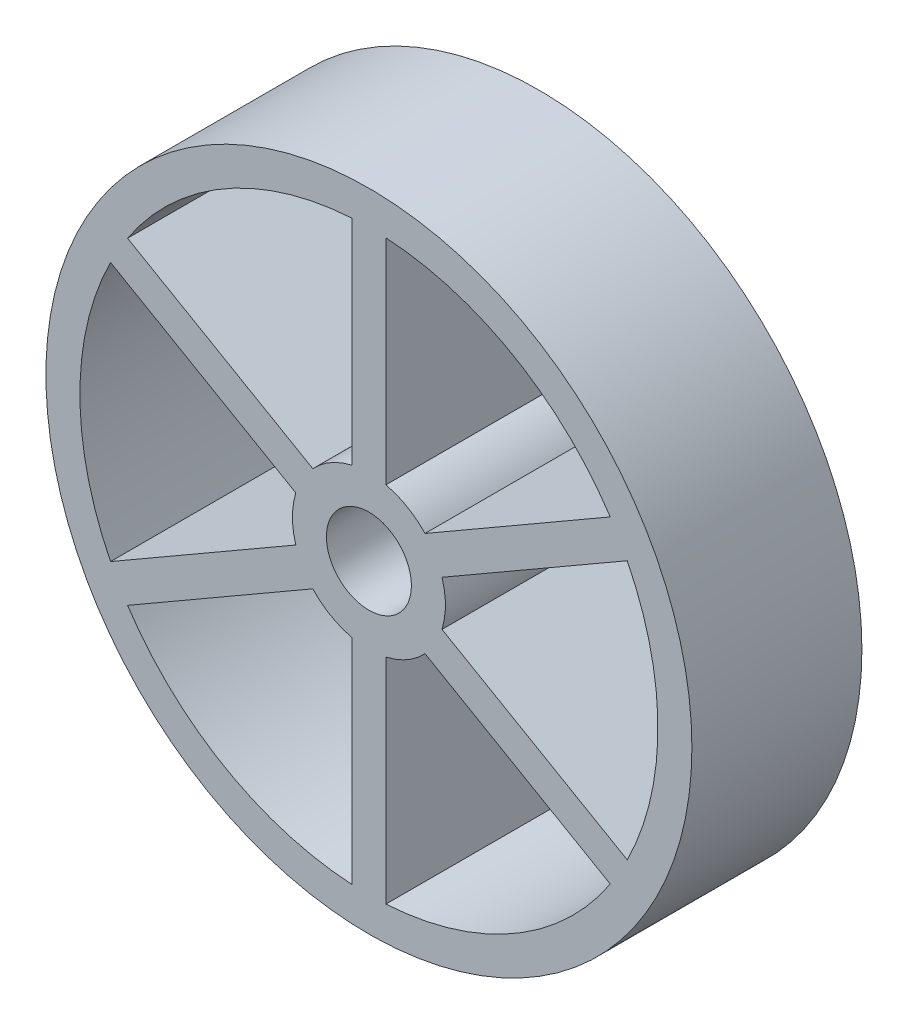
ISO-10303-21;
HEADER;
FILE_DESCRIPTION(('STEP AP214'),'2;1');
FILE_NAME('part.step','',(''),(''),'','','');
FILE_SCHEMA(('AUTOMOTIVE_DESIGN { 1 0 10303 214 1 1 1 1 }'));
ENDSEC;
DATA;
#1=APPLICATION_CONTEXT('core data for automotive mechanical design processes');
#2=APPLICATION_PROTOCOL_DEFINITION('international standard','automotive_design',2000,#1);
#3=PRODUCT_CONTEXT('',#1,'mechanical');
#4=PRODUCT('Part','Part','',(#3));
#5=PRODUCT_RELATED_PRODUCT_CATEGORY('part','',(#4));
#6=PRODUCT_DEFINITION_FORMATION('','',#4);
#7=PRODUCT_DEFINITION_CONTEXT('part definition',#1,'design');
#8=PRODUCT_DEFINITION('design','',#6,#7);
#9=PRODUCT_DEFINITION_SHAPE('','',#8);
#10=(LENGTH_UNIT() NAMED_UNIT(*) SI_UNIT(.MILLI.,.METRE.));
#11=(NAMED_UNIT(*) PLANE_ANGLE_UNIT() SI_UNIT($,.RADIAN.));
#12=(NAMED_UNIT(*) SI_UNIT($,.STERADIAN.) SOLID_ANGLE_UNIT());
#13=UNCERTAINTY_MEASURE_WITH_UNIT(LENGTH_MEASURE(1.E-05),#10,'distance_accuracy_value','');
#14=(GEOMETRIC_REPRESENTATION_CONTEXT(3) GLOBAL_UNCERTAINTY_ASSIGNED_CONTEXT((#13)) GLOBAL_UNIT_ASSIGNED_CONTEXT((#10,
#11,#12)) REPRESENTATION_CONTEXT('',''));
#15=CARTESIAN_POINT('',(0.,0.,0.));
#16=DIRECTION('',(0.,0.,1.));
#17=DIRECTION('',(1.,0.,0.));
#18=AXIS2_PLACEMENT_3D('',#15,#16,#17);
#19=CARTESIAN_POINT('',(0.,0.,10.));
#20=DIRECTION('',(0.,0.,-1.));
#21=DIRECTION('',(-1.,0.,0.));
#22=AXIS2_PLACEMENT_3D('',#19,#20,#21);
#23=CYLINDRICAL_SURFACE('',#22,19.);
#24=CARTESIAN_POINT('',(0.,0.,10.));
#25=DIRECTION('',(0.,0.,1.));
#26=DIRECTION('',(1.,0.,0.));
#27=AXIS2_PLACEMENT_3D('',#24,#25,#26);
#28=CIRCLE('',#27,19.);
#29=CARTESIAN_POINT('',(19.,0.,10.));
#30=VERTEX_POINT('',#29);
#31=EDGE_CURVE('E12',#30,#30,#28,.T.);
#32=ORIENTED_EDGE('',*,*,#31,.F.);
#33=EDGE_LOOP('',(#32));
#34=FACE_BOUND('',#33,.T.);
#35=CARTESIAN_POINT('',(0.,0.,0.));
#36=DIRECTION('',(0.,0.,1.));
#37=DIRECTION('',(1.,0.,0.));
#38=AXIS2_PLACEMENT_3D('',#35,#36,#37);
#39=CIRCLE('',#38,19.);
#40=CARTESIAN_POINT('',(19.,0.,0.));
#41=VERTEX_POINT('',#40);
#42=EDGE_CURVE('E132',#41,#41,#39,.T.);
#43=ORIENTED_EDGE('',*,*,#42,.T.);
#44=EDGE_LOOP('',(#43));
#45=FACE_BOUND('',#44,.T.);
#46=ADVANCED_FACE('F129',(#34,#45),#23,.T.);
#47=CARTESIAN_POINT('',(0.,0.,10.));
#48=DIRECTION('',(0.,0.,1.));
#49=DIRECTION('',(1.,0.,0.));
#50=AXIS2_PLACEMENT_3D('',#47,#48,#49);
#51=PLANE('',#50);
#52=DIRECTION('',(-0.866025403784438,-0.5,0.));
#53=VECTOR('',#52,1.);
#54=CARTESIAN_POINT('',(0.50000000000016,-0.866025403784714,10.));
#55=LINE('',#54,#53);
#56=CARTESIAN_POINT('',(-3.29967103839225,-3.0597665006326,10.));
#57=VERTEX_POINT('',#56);
#58=CARTESIAN_POINT('',(-14.1969384566989,-9.3513067780233,10.));
#59=VERTEX_POINT('',#58);
#60=EDGE_CURVE('E143',#57,#59,#55,.T.);
#61=ORIENTED_EDGE('',*,*,#60,.F.);
#62=CARTESIAN_POINT('',(0.,0.,10.));
#63=DIRECTION('',(0.,0.,1.));
#64=DIRECTION('',(1.,0.,0.));
#65=AXIS2_PLACEMENT_3D('',#62,#63,#64);
#66=CIRCLE('',#65,4.5);
#67=CARTESIAN_POINT('',(-0.999999999999511,-4.38748219369595,10.));
#68=VERTEX_POINT('',#67);
#69=EDGE_CURVE('E336',#57,#68,#66,.T.);
#70=ORIENTED_EDGE('',*,*,#69,.T.);
#71=DIRECTION('',(0.,-1.,0.));
#72=VECTOR('',#71,1.);
#73=CARTESIAN_POINT('',(-0.999999999999511,0.,10.));
#74=LINE('',#73,#72);
#75=CARTESIAN_POINT('',(-0.999999999999509,-16.970562748477,10.));
#76=VERTEX_POINT('',#75);
#77=EDGE_CURVE('E350',#68,#76,#74,.T.);
#78=ORIENTED_EDGE('',*,*,#77,.T.);
#79=CARTESIAN_POINT('',(0.,0.,10.));
#80=DIRECTION('',(0.,0.,1.));
#81=DIRECTION('',(1.,0.,0.));
#82=AXIS2_PLACEMENT_3D('',#79,#80,#81);
#83=CIRCLE('',#82,17.);
#84=EDGE_CURVE('E346',#59,#76,#83,.T.);
#85=ORIENTED_EDGE('',*,*,#84,.F.);
#86=EDGE_LOOP('',(#61,#70,#78,#85));
#87=FACE_BOUND('',#86,.T.);
#88=DIRECTION('',(-0.866025403784433,0.50000000000001,0.));
#89=VECTOR('',#88,1.);
#90=CARTESIAN_POINT('',(-0.500000000000011,-0.866025403784434,10.));
#91=LINE('',#90,#89);
#92=CARTESIAN_POINT('',(-4.29967103839265,1.32771569306364,10.));
#93=VERTEX_POINT('',#92);
#94=CARTESIAN_POINT('',(-15.196938456699,7.61925597045431,10.));
#95=VERTEX_POINT('',#94);
#96=EDGE_CURVE('E151',#93,#95,#91,.T.);
#97=ORIENTED_EDGE('',*,*,#96,.F.);
#98=CARTESIAN_POINT('',(0.,0.,10.));
#99=DIRECTION('',(0.,0.,1.));
#100=DIRECTION('',(1.,0.,0.));
#101=AXIS2_PLACEMENT_3D('',#98,#99,#100);
#102=CIRCLE('',#101,4.5);
#103=CARTESIAN_POINT('',(-4.29967103839225,-1.32771569306372,10.));
#104=VERTEX_POINT('',#103);
#105=EDGE_CURVE('E366',#93,#104,#102,.T.);
#106=ORIENTED_EDGE('',*,*,#105,.T.);
#107=DIRECTION('',(-0.866025403784438,-0.5,0.));
#108=VECTOR('',#107,1.);
#109=CARTESIAN_POINT('',(-0.499999999999841,0.866025403784163,10.));
#110=LINE('',#109,#108);
#111=CARTESIAN_POINT('',(-15.1969384566987,-7.61925597045427,10.));
#112=VERTEX_POINT('',#111);
#113=EDGE_CURVE('E379',#104,#112,#110,.T.);
#114=ORIENTED_EDGE('',*,*,#113,.T.);
#115=CARTESIAN_POINT('',(0.,0.,10.));
#116=DIRECTION('',(0.,0.,1.));
#117=DIRECTION('',(1.,0.,0.));
#118=AXIS2_PLACEMENT_3D('',#115,#116,#117);
#119=CIRCLE('',#118,17.);
#120=EDGE_CURVE('E376',#95,#112,#119,.T.);
#121=ORIENTED_EDGE('',*,*,#120,.F.);
#122=EDGE_LOOP('',(#97,#106,#114,#121));
#123=FACE_BOUND('',#122,.T.);
#124=DIRECTION('',(0.866025403784439,-0.5,0.));
#125=VECTOR('',#124,1.);
#126=CARTESIAN_POINT('',(0.500000000000208,0.866025403784799,10.));
#127=LINE('',#126,#125);
#128=CARTESIAN_POINT('',(4.29967103839299,-1.3277156930633,10.));
#129=VERTEX_POINT('',#128);
#130=CARTESIAN_POINT('',(15.1969384566993,-7.61925597045377,10.));
#131=VERTEX_POINT('',#130);
#132=EDGE_CURVE('E328',#129,#131,#127,.T.);
#133=ORIENTED_EDGE('',*,*,#132,.F.);
#134=CARTESIAN_POINT('',(0.,0.,10.));
#135=DIRECTION('',(0.,0.,1.));
#136=DIRECTION('',(1.,0.,0.));
#137=AXIS2_PLACEMENT_3D('',#134,#135,#136);
#138=CIRCLE('',#137,4.5);
#139=CARTESIAN_POINT('',(4.29967103839267,1.32771569306358,10.));
#140=VERTEX_POINT('',#139);
#141=EDGE_CURVE('E396',#129,#140,#138,.T.);
#142=ORIENTED_EDGE('',*,*,#141,.T.);
#143=DIRECTION('',(0.86602540378444,0.499999999999998,0.));
#144=VECTOR('',#143,1.);
#145=CARTESIAN_POINT('',(0.499999999999998,-0.86602540378444,10.));
#146=LINE('',#145,#144);
#147=CARTESIAN_POINT('',(15.1969384566991,7.6192559704541,10.));
#148=VERTEX_POINT('',#147);
#149=EDGE_CURVE('E409',#140,#148,#146,.T.);
#150=ORIENTED_EDGE('',*,*,#149,.T.);
#151=CARTESIAN_POINT('',(0.,0.,10.));
#152=DIRECTION('',(0.,0.,1.));
#153=DIRECTION('',(1.,0.,0.));
#154=AXIS2_PLACEMENT_3D('',#151,#152,#153);
#155=CIRCLE('',#154,17.);
#156=EDGE_CURVE('E406',#131,#148,#155,.T.);
#157=ORIENTED_EDGE('',*,*,#156,.F.);
#158=EDGE_LOOP('',(#133,#142,#150,#157));
#159=FACE_BOUND('',#158,.T.);
#160=DIRECTION('',(0.,-1.,0.));
#161=VECTOR('',#160,1.);
#162=CARTESIAN_POINT('',(1.00000000000049,0.,10.));
#163=LINE('',#162,#161);
#164=CARTESIAN_POINT('',(1.00000000000049,-4.38748219369595,10.));
#165=VERTEX_POINT('',#164);
#166=CARTESIAN_POINT('',(1.0000000000005,-16.9705627484771,10.));
#167=VERTEX_POINT('',#166);
#168=EDGE_CURVE('E416',#165,#167,#163,.T.);
#169=ORIENTED_EDGE('',*,*,#168,.F.);
#170=CARTESIAN_POINT('',(0.,0.,10.));
#171=DIRECTION('',(0.,0.,1.));
#172=DIRECTION('',(1.,0.,0.));
#173=AXIS2_PLACEMENT_3D('',#170,#171,#172);
#174=CIRCLE('',#173,4.5);
#175=CARTESIAN_POINT('',(3.29967103839299,-3.05976650063217,10.));
#176=VERTEX_POINT('',#175);
#177=EDGE_CURVE('E427',#165,#176,#174,.T.);
#178=ORIENTED_EDGE('',*,*,#177,.T.);
#179=DIRECTION('',(0.866025403784439,-0.5,0.));
#180=VECTOR('',#179,1.);
#181=CARTESIAN_POINT('',(-0.499999999999792,-0.86602540378408,10.));
#182=LINE('',#181,#180);
#183=CARTESIAN_POINT('',(14.1969384566994,-9.35130677802271,10.));
#184=VERTEX_POINT('',#183);
#185=EDGE_CURVE('E440',#176,#184,#182,.T.);
#186=ORIENTED_EDGE('',*,*,#185,.T.);
#187=CARTESIAN_POINT('',(0.,0.,10.));
#188=DIRECTION('',(0.,0.,1.));
#189=DIRECTION('',(1.,0.,0.));
#190=AXIS2_PLACEMENT_3D('',#187,#188,#189);
#191=CIRCLE('',#190,17.);
#192=EDGE_CURVE('E437',#167,#184,#191,.T.);
#193=ORIENTED_EDGE('',*,*,#192,.F.);
#194=EDGE_LOOP('',(#169,#178,#186,#193));
#195=FACE_BOUND('',#194,.T.);
#196=DIRECTION('',(0.86602540378444,0.499999999999998,0.));
#197=VECTOR('',#196,1.);
#198=CARTESIAN_POINT('',(-0.499999999999998,0.86602540378444,10.));
#199=LINE('',#198,#197);
#200=CARTESIAN_POINT('',(3.29967103839267,3.05976650063246,10.));
#201=VERTEX_POINT('',#200);
#202=CARTESIAN_POINT('',(14.1969384566991,9.35130677802298,10.));
#203=VERTEX_POINT('',#202);
#204=EDGE_CURVE('E296',#201,#203,#199,.T.);
#205=ORIENTED_EDGE('',*,*,#204,.F.);
#206=CARTESIAN_POINT('',(0.,0.,10.));
#207=DIRECTION('',(0.,0.,1.));
#208=DIRECTION('',(1.,0.,0.));
#209=AXIS2_PLACEMENT_3D('',#206,#207,#208);
#210=CIRCLE('',#209,4.5);
#211=CARTESIAN_POINT('',(1.,4.38748219369606,10.));
#212=VERTEX_POINT('',#211);
#213=EDGE_CURVE('E313',#201,#212,#210,.T.);
#214=ORIENTED_EDGE('',*,*,#213,.T.);
#215=DIRECTION('',(0.,1.,0.));
#216=VECTOR('',#215,1.);
#217=CARTESIAN_POINT('',(1.,0.,10.));
#218=LINE('',#217,#216);
#219=CARTESIAN_POINT('',(1.,16.9705627484771,10.));
#220=VERTEX_POINT('',#219);
#221=EDGE_CURVE('E316',#212,#220,#218,.T.);
#222=ORIENTED_EDGE('',*,*,#221,.T.);
#223=CARTESIAN_POINT('',(0.,0.,10.));
#224=DIRECTION('',(0.,0.,1.));
#225=DIRECTION('',(1.,0.,0.));
#226=AXIS2_PLACEMENT_3D('',#223,#224,#225);
#227=CIRCLE('',#226,17.);
#228=EDGE_CURVE('E322',#203,#220,#227,.T.);
#229=ORIENTED_EDGE('',*,*,#228,.F.);
#230=EDGE_LOOP('',(#205,#214,#222,#229));
#231=FACE_BOUND('',#230,.T.);
#232=DIRECTION('',(0.,1.,0.));
#233=VECTOR('',#232,1.);
#234=CARTESIAN_POINT('',(-1.,0.,10.));
#235=LINE('',#234,#233);
#236=CARTESIAN_POINT('',(-1.,4.38748219369606,10.));
#237=VERTEX_POINT('',#236);
#238=CARTESIAN_POINT('',(-1.,16.9705627484771,10.));
#239=VERTEX_POINT('',#238);
#240=EDGE_CURVE('E386',#237,#239,#235,.T.);
#241=ORIENTED_EDGE('',*,*,#240,.F.);
#242=CARTESIAN_POINT('',(0.,0.,10.));
#243=DIRECTION('',(0.,0.,1.));
#244=DIRECTION('',(1.,0.,0.));
#245=AXIS2_PLACEMENT_3D('',#242,#243,#244);
#246=CIRCLE('',#245,4.5);
#247=CARTESIAN_POINT('',(-3.29967103839263,3.05976650063251,10.));
#248=VERTEX_POINT('',#247);
#249=EDGE_CURVE('E456',#237,#248,#246,.T.);
#250=ORIENTED_EDGE('',*,*,#249,.T.);
#251=DIRECTION('',(-0.866025403784433,0.50000000000001,0.));
#252=VECTOR('',#251,1.);
#253=CARTESIAN_POINT('',(0.50000000000001,0.866025403784432,10.));
#254=LINE('',#253,#252);
#255=CARTESIAN_POINT('',(-14.196938456699,9.35130677802318,10.));
#256=VERTEX_POINT('',#255);
#257=EDGE_CURVE('E469',#248,#256,#254,.T.);
#258=ORIENTED_EDGE('',*,*,#257,.T.);
#259=CARTESIAN_POINT('',(0.,0.,10.));
#260=DIRECTION('',(0.,0.,1.));
#261=DIRECTION('',(1.,0.,0.));
#262=AXIS2_PLACEMENT_3D('',#259,#260,#261);
#263=CIRCLE('',#262,17.);
#264=EDGE_CURVE('E466',#239,#256,#263,.T.);
#265=ORIENTED_EDGE('',*,*,#264,.F.);
#266=EDGE_LOOP('',(#241,#250,#258,#265));
#267=FACE_BOUND('',#266,.T.);
#268=CARTESIAN_POINT('',(0.,0.,10.));
#269=DIRECTION('',(0.,0.,1.));
#270=DIRECTION('',(1.,0.,0.));
#271=AXIS2_PLACEMENT_3D('',#268,#269,#270);
#272=CIRCLE('',#271,2.5);
#273=CARTESIAN_POINT('',(2.5,0.,10.));
#274=VERTEX_POINT('',#273);
#275=EDGE_CURVE('E476',#274,#274,#272,.T.);
#276=ORIENTED_EDGE('',*,*,#275,.F.);
#277=EDGE_LOOP('',(#276));
#278=FACE_BOUND('',#277,.T.);
#279=ORIENTED_EDGE('',*,*,#31,.T.);
#280=EDGE_LOOP('',(#279));
#281=FACE_BOUND('',#280,.T.);
#282=ADVANCED_FACE('F491',(#87,#123,#159,#195,#231,#267,#278,#281),#51,.T.);
#283=CARTESIAN_POINT('',(0.,0.,0.));
#284=DIRECTION('',(0.,0.,1.));
#285=DIRECTION('',(1.,0.,0.));
#286=AXIS2_PLACEMENT_3D('',#283,#284,#285);
#287=PLANE('',#286);
#288=CARTESIAN_POINT('',(0.,0.,0.));
#289=DIRECTION('',(0.,0.,1.));
#290=DIRECTION('',(1.,0.,0.));
#291=AXIS2_PLACEMENT_3D('',#288,#289,#290);
#292=CIRCLE('',#291,4.5);
#293=CARTESIAN_POINT('',(-3.29967103839225,-3.0597665006326,0.));
#294=VERTEX_POINT('',#293);
#295=CARTESIAN_POINT('',(-0.999999999999511,-4.38748219369595,0.));
#296=VERTEX_POINT('',#295);
#297=EDGE_CURVE('E342',#294,#296,#292,.T.);
#298=ORIENTED_EDGE('',*,*,#297,.F.);
#299=DIRECTION('',(-0.866025403784438,-0.5,0.));
#300=VECTOR('',#299,1.);
#301=CARTESIAN_POINT('',(0.50000000000016,-0.866025403784714,0.));
#302=LINE('',#301,#300);
#303=CARTESIAN_POINT('',(-14.1969384566987,-9.35130677802315,0.));
#304=VERTEX_POINT('',#303);
#305=EDGE_CURVE('E332',#294,#304,#302,.T.);
#306=ORIENTED_EDGE('',*,*,#305,.T.);
#307=CARTESIAN_POINT('',(0.,0.,0.));
#308=DIRECTION('',(0.,0.,1.));
#309=DIRECTION('',(1.,0.,0.));
#310=AXIS2_PLACEMENT_3D('',#307,#308,#309);
#311=CIRCLE('',#310,17.);
#312=CARTESIAN_POINT('',(-0.999999999999517,-16.9705627484772,0.));
#313=VERTEX_POINT('',#312);
#314=EDGE_CURVE('E335',#304,#313,#311,.T.);
#315=ORIENTED_EDGE('',*,*,#314,.T.);
#316=DIRECTION('',(0.,-1.,0.));
#317=VECTOR('',#316,1.);
#318=CARTESIAN_POINT('',(-0.999999999999511,0.,0.));
#319=LINE('',#318,#317);
#320=EDGE_CURVE('E339',#296,#313,#319,.T.);
#321=ORIENTED_EDGE('',*,*,#320,.F.);
#322=EDGE_LOOP('',(#298,#306,#315,#321));
#323=FACE_BOUND('',#322,.T.);
#324=CARTESIAN_POINT('',(0.,0.,0.));
#325=DIRECTION('',(0.,0.,1.));
#326=DIRECTION('',(1.,0.,0.));
#327=AXIS2_PLACEMENT_3D('',#324,#325,#326);
#328=CIRCLE('',#327,4.5);
#329=CARTESIAN_POINT('',(-4.29967103839265,1.32771569306364,0.));
#330=VERTEX_POINT('',#329);
#331=CARTESIAN_POINT('',(-4.29967103839225,-1.32771569306372,0.));
#332=VERTEX_POINT('',#331);
#333=EDGE_CURVE('E372',#330,#332,#328,.T.);
#334=ORIENTED_EDGE('',*,*,#333,.F.);
#335=DIRECTION('',(-0.866025403784433,0.50000000000001,0.));
#336=VECTOR('',#335,1.);
#337=CARTESIAN_POINT('',(-0.500000000000011,-0.866025403784434,0.));
#338=LINE('',#337,#336);
#339=CARTESIAN_POINT('',(-15.196938456699,7.61925597045431,0.));
#340=VERTEX_POINT('',#339);
#341=EDGE_CURVE('E362',#330,#340,#338,.T.);
#342=ORIENTED_EDGE('',*,*,#341,.T.);
#343=CARTESIAN_POINT('',(0.,0.,0.));
#344=DIRECTION('',(0.,0.,1.));
#345=DIRECTION('',(1.,0.,0.));
#346=AXIS2_PLACEMENT_3D('',#343,#344,#345);
#347=CIRCLE('',#346,17.);
#348=CARTESIAN_POINT('',(-15.1969384566989,-7.61925597045441,0.));
#349=VERTEX_POINT('',#348);
#350=EDGE_CURVE('E365',#340,#349,#347,.T.);
#351=ORIENTED_EDGE('',*,*,#350,.T.);
#352=DIRECTION('',(-0.866025403784438,-0.5,0.));
#353=VECTOR('',#352,1.);
#354=CARTESIAN_POINT('',(-0.499999999999841,0.866025403784163,0.));
#355=LINE('',#354,#353);
#356=EDGE_CURVE('E369',#332,#349,#355,.T.);
#357=ORIENTED_EDGE('',*,*,#356,.F.);
#358=EDGE_LOOP('',(#334,#342,#351,#357));
#359=FACE_BOUND('',#358,.T.);
#360=CARTESIAN_POINT('',(0.,0.,0.));
#361=DIRECTION('',(0.,0.,1.));
#362=DIRECTION('',(1.,0.,0.));
#363=AXIS2_PLACEMENT_3D('',#360,#361,#362);
#364=CIRCLE('',#363,4.5);
#365=CARTESIAN_POINT('',(4.29967103839299,-1.3277156930633,0.));
#366=VERTEX_POINT('',#365);
#367=CARTESIAN_POINT('',(4.29967103839267,1.32771569306358,0.));
#368=VERTEX_POINT('',#367);
#369=EDGE_CURVE('E402',#366,#368,#364,.T.);
#370=ORIENTED_EDGE('',*,*,#369,.F.);
#371=DIRECTION('',(0.866025403784439,-0.5,0.));
#372=VECTOR('',#371,1.);
#373=CARTESIAN_POINT('',(0.500000000000208,0.866025403784799,0.));
#374=LINE('',#373,#372);
#375=CARTESIAN_POINT('',(15.1969384566994,-7.61925597045384,0.));
#376=VERTEX_POINT('',#375);
#377=EDGE_CURVE('E392',#366,#376,#374,.T.);
#378=ORIENTED_EDGE('',*,*,#377,.T.);
#379=CARTESIAN_POINT('',(0.,0.,0.));
#380=DIRECTION('',(0.,0.,1.));
#381=DIRECTION('',(1.,0.,0.));
#382=AXIS2_PLACEMENT_3D('',#379,#380,#381);
#383=CIRCLE('',#382,17.);
#384=CARTESIAN_POINT('',(15.1969384566991,7.6192559704541,0.));
#385=VERTEX_POINT('',#384);
#386=EDGE_CURVE('E395',#376,#385,#383,.T.);
#387=ORIENTED_EDGE('',*,*,#386,.T.);
#388=DIRECTION('',(0.86602540378444,0.499999999999998,0.));
#389=VECTOR('',#388,1.);
#390=CARTESIAN_POINT('',(0.499999999999998,-0.86602540378444,0.));
#391=LINE('',#390,#389);
#392=EDGE_CURVE('E399',#368,#385,#391,.T.);
#393=ORIENTED_EDGE('',*,*,#392,.F.);
#394=EDGE_LOOP('',(#370,#378,#387,#393));
#395=FACE_BOUND('',#394,.T.);
#396=CARTESIAN_POINT('',(0.,0.,0.));
#397=DIRECTION('',(0.,0.,1.));
#398=DIRECTION('',(1.,0.,0.));
#399=AXIS2_PLACEMENT_3D('',#396,#397,#398);
#400=CIRCLE('',#399,4.5);
#401=CARTESIAN_POINT('',(1.00000000000049,-4.38748219369595,0.));
#402=VERTEX_POINT('',#401);
#403=CARTESIAN_POINT('',(3.29967103839299,-3.05976650063217,0.));
#404=VERTEX_POINT('',#403);
#405=EDGE_CURVE('E433',#402,#404,#400,.T.);
#406=ORIENTED_EDGE('',*,*,#405,.F.);
#407=DIRECTION('',(0.,-1.,0.));
#408=VECTOR('',#407,1.);
#409=CARTESIAN_POINT('',(1.00000000000049,0.,0.));
#410=LINE('',#409,#408);
#411=CARTESIAN_POINT('',(1.00000000000049,-16.970562748477,0.));
#412=VERTEX_POINT('',#411);
#413=EDGE_CURVE('E423',#402,#412,#410,.T.);
#414=ORIENTED_EDGE('',*,*,#413,.T.);
#415=CARTESIAN_POINT('',(0.,0.,0.));
#416=DIRECTION('',(0.,0.,1.));
#417=DIRECTION('',(1.,0.,0.));
#418=AXIS2_PLACEMENT_3D('',#415,#416,#417);
#419=CIRCLE('',#418,17.);
#420=CARTESIAN_POINT('',(14.1969384566993,-9.35130677802266,0.));
#421=VERTEX_POINT('',#420);
#422=EDGE_CURVE('E426',#412,#421,#419,.T.);
#423=ORIENTED_EDGE('',*,*,#422,.T.);
#424=DIRECTION('',(0.866025403784439,-0.5,0.));
#425=VECTOR('',#424,1.);
#426=CARTESIAN_POINT('',(-0.499999999999792,-0.86602540378408,0.));
#427=LINE('',#426,#425);
#428=EDGE_CURVE('E430',#404,#421,#427,.T.);
#429=ORIENTED_EDGE('',*,*,#428,.F.);
#430=EDGE_LOOP('',(#406,#414,#423,#429));
#431=FACE_BOUND('',#430,.T.);
#432=CARTESIAN_POINT('',(0.,0.,0.));
#433=DIRECTION('',(0.,0.,1.));
#434=DIRECTION('',(1.,0.,0.));
#435=AXIS2_PLACEMENT_3D('',#432,#433,#434);
#436=CIRCLE('',#435,4.5);
#437=CARTESIAN_POINT('',(3.29967103839267,3.05976650063246,0.));
#438=VERTEX_POINT('',#437);
#439=CARTESIAN_POINT('',(1.,4.38748219369606,0.));
#440=VERTEX_POINT('',#439);
#441=EDGE_CURVE('E301',#438,#440,#436,.T.);
#442=ORIENTED_EDGE('',*,*,#441,.F.);
#443=DIRECTION('',(0.86602540378444,0.499999999999998,0.));
#444=VECTOR('',#443,1.);
#445=CARTESIAN_POINT('',(-0.499999999999998,0.86602540378444,0.));
#446=LINE('',#445,#444);
#447=CARTESIAN_POINT('',(14.1969384566991,9.35130677802298,0.));
#448=VERTEX_POINT('',#447);
#449=EDGE_CURVE('E293',#438,#448,#446,.T.);
#450=ORIENTED_EDGE('',*,*,#449,.T.);
#451=CARTESIAN_POINT('',(0.,0.,0.));
#452=DIRECTION('',(0.,0.,1.));
#453=DIRECTION('',(1.,0.,0.));
#454=AXIS2_PLACEMENT_3D('',#451,#452,#453);
#455=CIRCLE('',#454,17.);
#456=CARTESIAN_POINT('',(1.,16.9705627484771,0.));
#457=VERTEX_POINT('',#456);
#458=EDGE_CURVE('E304',#448,#457,#455,.T.);
#459=ORIENTED_EDGE('',*,*,#458,.T.);
#460=DIRECTION('',(0.,1.,0.));
#461=VECTOR('',#460,1.);
#462=CARTESIAN_POINT('',(1.,0.,0.));
#463=LINE('',#462,#461);
#464=EDGE_CURVE('E309',#440,#457,#463,.T.);
#465=ORIENTED_EDGE('',*,*,#464,.F.);
#466=EDGE_LOOP('',(#442,#450,#459,#465));
#467=FACE_BOUND('',#466,.T.);
#468=CARTESIAN_POINT('',(0.,0.,0.));
#469=DIRECTION('',(0.,0.,1.));
#470=DIRECTION('',(1.,0.,0.));
#471=AXIS2_PLACEMENT_3D('',#468,#469,#470);
#472=CIRCLE('',#471,4.5);
#473=CARTESIAN_POINT('',(-1.,4.38748219369606,0.));
#474=VERTEX_POINT('',#473);
#475=CARTESIAN_POINT('',(-3.29967103839263,3.05976650063251,0.));
#476=VERTEX_POINT('',#475);
#477=EDGE_CURVE('E462',#474,#476,#472,.T.);
#478=ORIENTED_EDGE('',*,*,#477,.F.);
#479=DIRECTION('',(0.,1.,0.));
#480=VECTOR('',#479,1.);
#481=CARTESIAN_POINT('',(-1.,0.,0.));
#482=LINE('',#481,#480);
#483=CARTESIAN_POINT('',(-1.,16.9705627484771,0.));
#484=VERTEX_POINT('',#483);
#485=EDGE_CURVE('E452',#474,#484,#482,.T.);
#486=ORIENTED_EDGE('',*,*,#485,.T.);
#487=CARTESIAN_POINT('',(0.,0.,0.));
#488=DIRECTION('',(0.,0.,1.));
#489=DIRECTION('',(1.,0.,0.));
#490=AXIS2_PLACEMENT_3D('',#487,#488,#489);
#491=CIRCLE('',#490,17.);
#492=CARTESIAN_POINT('',(-14.196938456699,9.35130677802318,0.));
#493=VERTEX_POINT('',#492);
#494=EDGE_CURVE('E455',#484,#493,#491,.T.);
#495=ORIENTED_EDGE('',*,*,#494,.T.);
#496=DIRECTION('',(-0.866025403784433,0.50000000000001,0.));
#497=VECTOR('',#496,1.);
#498=CARTESIAN_POINT('',(0.50000000000001,0.866025403784432,0.));
#499=LINE('',#498,#497);
#500=EDGE_CURVE('E459',#476,#493,#499,.T.);
#501=ORIENTED_EDGE('',*,*,#500,.F.);
#502=EDGE_LOOP('',(#478,#486,#495,#501));
#503=FACE_BOUND('',#502,.T.);
#504=CARTESIAN_POINT('',(0.,0.,0.));
#505=DIRECTION('',(0.,0.,1.));
#506=DIRECTION('',(1.,0.,0.));
#507=AXIS2_PLACEMENT_3D('',#504,#505,#506);
#508=CIRCLE('',#507,2.5);
#509=CARTESIAN_POINT('',(2.5,0.,0.));
#510=VERTEX_POINT('',#509);
#511=EDGE_CURVE('E483',#510,#510,#508,.T.);
#512=ORIENTED_EDGE('',*,*,#511,.T.);
#513=EDGE_LOOP('',(#512));
#514=FACE_BOUND('',#513,.T.);
#515=ORIENTED_EDGE('',*,*,#42,.F.);
#516=EDGE_LOOP('',(#515));
#517=FACE_BOUND('',#516,.T.);
#518=ADVANCED_FACE('F311',(#323,#359,#395,#431,#467,#503,#514,#517),#287,.F.);
#519=CARTESIAN_POINT('',(0.,0.,0.));
#520=DIRECTION('',(0.,0.,1.));
#521=DIRECTION('',(1.,0.,0.));
#522=AXIS2_PLACEMENT_3D('',#519,#520,#521);
#523=CYLINDRICAL_SURFACE('',#522,2.5);
#524=ORIENTED_EDGE('',*,*,#511,.F.);
#525=EDGE_LOOP('',(#524));
#526=FACE_BOUND('',#525,.T.);
#527=ORIENTED_EDGE('',*,*,#275,.T.);
#528=EDGE_LOOP('',(#527));
#529=FACE_BOUND('',#528,.T.);
#530=ADVANCED_FACE('F489',(#526,#529),#523,.F.);
#531=CARTESIAN_POINT('',(-1.,0.,0.));
#532=DIRECTION('',(1.,0.,0.));
#533=DIRECTION('',(0.,0.,-1.));
#534=AXIS2_PLACEMENT_3D('',#531,#532,#533);
#535=PLANE('',#534);
#536=ORIENTED_EDGE('',*,*,#240,.T.);
#537=DIRECTION('',(0.,0.,1.));
#538=VECTOR('',#537,1.);
#539=CARTESIAN_POINT('',(-1.,16.9705627484771,0.));
#540=LINE('',#539,#538);
#541=EDGE_CURVE('E464',#484,#239,#540,.T.);
#542=ORIENTED_EDGE('',*,*,#541,.F.);
#543=ORIENTED_EDGE('',*,*,#485,.F.);
#544=DIRECTION('',(0.,0.,1.));
#545=VECTOR('',#544,1.);
#546=CARTESIAN_POINT('',(-1.,4.38748219369606,0.));
#547=LINE('',#546,#545);
#548=EDGE_CURVE('E474',#474,#237,#547,.T.);
#549=ORIENTED_EDGE('',*,*,#548,.T.);
#550=EDGE_LOOP('',(#536,#542,#543,#549));
#551=FACE_BOUND('',#550,.T.);
#552=ADVANCED_FACE('F508',(#551),#535,.F.);
#553=CARTESIAN_POINT('',(0.,0.,0.));
#554=DIRECTION('',(0.,0.,1.));
#555=DIRECTION('',(1.,0.,0.));
#556=AXIS2_PLACEMENT_3D('',#553,#554,#555);
#557=CYLINDRICAL_SURFACE('',#556,4.5);
#558=ORIENTED_EDGE('',*,*,#249,.F.);
#559=ORIENTED_EDGE('',*,*,#548,.F.);
#560=ORIENTED_EDGE('',*,*,#477,.T.);
#561=DIRECTION('',(0.,0.,1.));
#562=VECTOR('',#561,1.);
#563=CARTESIAN_POINT('',(-3.29967103839263,3.05976650063251,0.));
#564=LINE('',#563,#562);
#565=EDGE_CURVE('E477',#476,#248,#564,.T.);
#566=ORIENTED_EDGE('',*,*,#565,.T.);
#567=EDGE_LOOP('',(#558,#559,#560,#566));
#568=FACE_BOUND('',#567,.T.);
#569=ADVANCED_FACE('F516',(#568),#557,.T.);
#570=CARTESIAN_POINT('',(0.50000000000001,0.866025403784432,0.));
#571=DIRECTION('',(0.50000000000001,0.866025403784433,0.));
#572=DIRECTION('',(-0.866025403784433,0.50000000000001,0.));
#573=AXIS2_PLACEMENT_3D('',#570,#571,#572);
#574=PLANE('',#573);
#575=ORIENTED_EDGE('',*,*,#257,.F.);
#576=ORIENTED_EDGE('',*,*,#565,.F.);
#577=ORIENTED_EDGE('',*,*,#500,.T.);
#578=DIRECTION('',(0.,0.,1.));
#579=VECTOR('',#578,1.);
#580=CARTESIAN_POINT('',(-14.196938456699,9.35130677802318,0.));
#581=LINE('',#580,#579);
#582=EDGE_CURVE('E479',#493,#256,#581,.T.);
#583=ORIENTED_EDGE('',*,*,#582,.T.);
#584=EDGE_LOOP('',(#575,#576,#577,#583));
#585=FACE_BOUND('',#584,.T.);
#586=ADVANCED_FACE('F521',(#585),#574,.T.);
#587=CARTESIAN_POINT('',(0.,0.,0.));
#588=DIRECTION('',(0.,0.,1.));
#589=DIRECTION('',(1.,0.,0.));
#590=AXIS2_PLACEMENT_3D('',#587,#588,#589);
#591=CYLINDRICAL_SURFACE('',#590,17.);
#592=ORIENTED_EDGE('',*,*,#264,.T.);
#593=ORIENTED_EDGE('',*,*,#582,.F.);
#594=ORIENTED_EDGE('',*,*,#494,.F.);
#595=ORIENTED_EDGE('',*,*,#541,.T.);
#596=EDGE_LOOP('',(#592,#593,#594,#595));
#597=FACE_BOUND('',#596,.T.);
#598=ADVANCED_FACE('F518',(#597),#591,.F.);
#599=CARTESIAN_POINT('',(-0.499999999999998,0.86602540378444,0.));
#600=DIRECTION('',(0.499999999999998,-0.86602540378444,0.));
#601=DIRECTION('',(0.86602540378444,0.499999999999998,0.));
#602=AXIS2_PLACEMENT_3D('',#599,#600,#601);
#603=PLANE('',#602);
#604=ORIENTED_EDGE('',*,*,#204,.T.);
#605=DIRECTION('',(0.,0.,1.));
#606=VECTOR('',#605,1.);
#607=CARTESIAN_POINT('',(14.1969384566991,9.35130677802298,0.));
#608=LINE('',#607,#606);
#609=EDGE_CURVE('E289',#448,#203,#608,.T.);
#610=ORIENTED_EDGE('',*,*,#609,.F.);
#611=ORIENTED_EDGE('',*,*,#449,.F.);
#612=DIRECTION('',(0.,0.,1.));
#613=VECTOR('',#612,1.);
#614=CARTESIAN_POINT('',(3.29967103839267,3.05976650063246,0.));
#615=LINE('',#614,#613);
#616=EDGE_CURVE('E326',#438,#201,#615,.T.);
#617=ORIENTED_EDGE('',*,*,#616,.T.);
#618=EDGE_LOOP('',(#604,#610,#611,#617));
#619=FACE_BOUND('',#618,.T.);
#620=ADVANCED_FACE('F291',(#619),#603,.F.);
#621=CARTESIAN_POINT('',(0.,0.,0.));
#622=DIRECTION('',(0.,0.,1.));
#623=DIRECTION('',(1.,0.,0.));
#624=AXIS2_PLACEMENT_3D('',#621,#622,#623);
#625=CYLINDRICAL_SURFACE('',#624,4.5);
#626=ORIENTED_EDGE('',*,*,#213,.F.);
#627=ORIENTED_EDGE('',*,*,#616,.F.);
#628=ORIENTED_EDGE('',*,*,#441,.T.);
#629=DIRECTION('',(0.,0.,1.));
#630=VECTOR('',#629,1.);
#631=CARTESIAN_POINT('',(1.,4.38748219369606,0.));
#632=LINE('',#631,#630);
#633=EDGE_CURVE('E329',#440,#212,#632,.T.);
#634=ORIENTED_EDGE('',*,*,#633,.T.);
#635=EDGE_LOOP('',(#626,#627,#628,#634));
#636=FACE_BOUND('',#635,.T.);
#637=ADVANCED_FACE('F593',(#636),#625,.T.);
#638=CARTESIAN_POINT('',(1.,0.,0.));
#639=DIRECTION('',(1.,0.,0.));
#640=DIRECTION('',(0.,0.,-1.));
#641=AXIS2_PLACEMENT_3D('',#638,#639,#640);
#642=PLANE('',#641);
#643=ORIENTED_EDGE('',*,*,#221,.F.);
#644=ORIENTED_EDGE('',*,*,#633,.F.);
#645=ORIENTED_EDGE('',*,*,#464,.T.);
#646=DIRECTION('',(0.,0.,1.));
#647=VECTOR('',#646,1.);
#648=CARTESIAN_POINT('',(1.,16.9705627484771,0.));
#649=LINE('',#648,#647);
#650=EDGE_CURVE('E300',#457,#220,#649,.T.);
#651=ORIENTED_EDGE('',*,*,#650,.T.);
#652=EDGE_LOOP('',(#643,#644,#645,#651));
#653=FACE_BOUND('',#652,.T.);
#654=ADVANCED_FACE('F596',(#653),#642,.T.);
#655=CARTESIAN_POINT('',(0.,0.,0.));
#656=DIRECTION('',(0.,0.,1.));
#657=DIRECTION('',(1.,0.,0.));
#658=AXIS2_PLACEMENT_3D('',#655,#656,#657);
#659=CYLINDRICAL_SURFACE('',#658,17.);
#660=ORIENTED_EDGE('',*,*,#228,.T.);
#661=ORIENTED_EDGE('',*,*,#650,.F.);
#662=ORIENTED_EDGE('',*,*,#458,.F.);
#663=ORIENTED_EDGE('',*,*,#609,.T.);
#664=EDGE_LOOP('',(#660,#661,#662,#663));
#665=FACE_BOUND('',#664,.T.);
#666=ADVANCED_FACE('F305',(#665),#659,.F.);
#667=CARTESIAN_POINT('',(1.00000000000049,0.,0.));
#668=DIRECTION('',(-1.,0.,0.));
#669=DIRECTION('',(0.,-1.,0.));
#670=AXIS2_PLACEMENT_3D('',#667,#668,#669);
#671=PLANE('',#670);
#672=ORIENTED_EDGE('',*,*,#168,.T.);
#673=DIRECTION('',(0.,0.,1.));
#674=VECTOR('',#673,1.);
#675=CARTESIAN_POINT('',(1.00000000000049,-16.970562748477,0.));
#676=LINE('',#675,#674);
#677=EDGE_CURVE('E435',#412,#167,#676,.T.);
#678=ORIENTED_EDGE('',*,*,#677,.F.);
#679=ORIENTED_EDGE('',*,*,#413,.F.);
#680=DIRECTION('',(0.,0.,1.));
#681=VECTOR('',#680,1.);
#682=CARTESIAN_POINT('',(1.00000000000049,-4.38748219369595,0.));
#683=LINE('',#682,#681);
#684=EDGE_CURVE('E347',#402,#165,#683,.T.);
#685=ORIENTED_EDGE('',*,*,#684,.T.);
#686=EDGE_LOOP('',(#672,#678,#679,#685));
#687=FACE_BOUND('',#686,.T.);
#688=ADVANCED_FACE('F529',(#687),#671,.F.);
#689=CARTESIAN_POINT('',(0.,0.,0.));
#690=DIRECTION('',(0.,0.,1.));
#691=DIRECTION('',(1.,0.,0.));
#692=AXIS2_PLACEMENT_3D('',#689,#690,#691);
#693=CYLINDRICAL_SURFACE('',#692,4.5);
#694=ORIENTED_EDGE('',*,*,#177,.F.);
#695=ORIENTED_EDGE('',*,*,#684,.F.);
#696=ORIENTED_EDGE('',*,*,#405,.T.);
#697=DIRECTION('',(0.,0.,1.));
#698=VECTOR('',#697,1.);
#699=CARTESIAN_POINT('',(3.29967103839299,-3.05976650063217,0.));
#700=LINE('',#699,#698);
#701=EDGE_CURVE('E446',#404,#176,#700,.T.);
#702=ORIENTED_EDGE('',*,*,#701,.T.);
#703=EDGE_LOOP('',(#694,#695,#696,#702));
#704=FACE_BOUND('',#703,.T.);
#705=ADVANCED_FACE('F532',(#704),#693,.T.);
#706=CARTESIAN_POINT('',(-0.499999999999792,-0.86602540378408,0.));
#707=DIRECTION('',(-0.5,-0.866025403784439,0.));
#708=DIRECTION('',(0.866025403784439,-0.5,0.));
#709=AXIS2_PLACEMENT_3D('',#706,#707,#708);
#710=PLANE('',#709);
#711=ORIENTED_EDGE('',*,*,#185,.F.);
#712=ORIENTED_EDGE('',*,*,#701,.F.);
#713=ORIENTED_EDGE('',*,*,#428,.T.);
#714=DIRECTION('',(0.,0.,1.));
#715=VECTOR('',#714,1.);
#716=CARTESIAN_POINT('',(14.1969384566994,-9.35130677802271,0.));
#717=LINE('',#716,#715);
#718=EDGE_CURVE('E448',#421,#184,#717,.T.);
#719=ORIENTED_EDGE('',*,*,#718,.T.);
#720=EDGE_LOOP('',(#711,#712,#713,#719));
#721=FACE_BOUND('',#720,.T.);
#722=ADVANCED_FACE('F538',(#721),#710,.T.);
#723=CARTESIAN_POINT('',(0.,0.,0.));
#724=DIRECTION('',(0.,0.,1.));
#725=DIRECTION('',(1.,0.,0.));
#726=AXIS2_PLACEMENT_3D('',#723,#724,#725);
#727=CYLINDRICAL_SURFACE('',#726,17.);
#728=ORIENTED_EDGE('',*,*,#192,.T.);
#729=ORIENTED_EDGE('',*,*,#718,.F.);
#730=ORIENTED_EDGE('',*,*,#422,.F.);
#731=ORIENTED_EDGE('',*,*,#677,.T.);
#732=EDGE_LOOP('',(#728,#729,#730,#731));
#733=FACE_BOUND('',#732,.T.);
#734=ADVANCED_FACE('F534',(#733),#727,.F.);
#735=CARTESIAN_POINT('',(0.500000000000208,0.866025403784799,0.));
#736=DIRECTION('',(-0.5,-0.866025403784439,0.));
#737=DIRECTION('',(0.866025403784439,-0.5,0.));
#738=AXIS2_PLACEMENT_3D('',#735,#736,#737);
#739=PLANE('',#738);
#740=ORIENTED_EDGE('',*,*,#132,.T.);
#741=DIRECTION('',(0.,0.,1.));
#742=VECTOR('',#741,1.);
#743=CARTESIAN_POINT('',(15.1969384566994,-7.61925597045384,0.));
#744=LINE('',#743,#742);
#745=EDGE_CURVE('E404',#376,#131,#744,.T.);
#746=ORIENTED_EDGE('',*,*,#745,.F.);
#747=ORIENTED_EDGE('',*,*,#377,.F.);
#748=DIRECTION('',(0.,0.,1.));
#749=VECTOR('',#748,1.);
#750=CARTESIAN_POINT('',(4.29967103839299,-1.3277156930633,0.));
#751=LINE('',#750,#749);
#752=EDGE_CURVE('E414',#366,#129,#751,.T.);
#753=ORIENTED_EDGE('',*,*,#752,.T.);
#754=EDGE_LOOP('',(#740,#746,#747,#753));
#755=FACE_BOUND('',#754,.T.);
#756=ADVANCED_FACE('F537',(#755),#739,.F.);
#757=CARTESIAN_POINT('',(0.,0.,0.));
#758=DIRECTION('',(0.,0.,1.));
#759=DIRECTION('',(1.,0.,0.));
#760=AXIS2_PLACEMENT_3D('',#757,#758,#759);
#761=CYLINDRICAL_SURFACE('',#760,4.5);
#762=ORIENTED_EDGE('',*,*,#141,.F.);
#763=ORIENTED_EDGE('',*,*,#752,.F.);
#764=ORIENTED_EDGE('',*,*,#369,.T.);
#765=DIRECTION('',(0.,0.,1.));
#766=VECTOR('',#765,1.);
#767=CARTESIAN_POINT('',(4.29967103839267,1.32771569306358,0.));
#768=LINE('',#767,#766);
#769=EDGE_CURVE('E417',#368,#140,#768,.T.);
#770=ORIENTED_EDGE('',*,*,#769,.T.);
#771=EDGE_LOOP('',(#762,#763,#764,#770));
#772=FACE_BOUND('',#771,.T.);
#773=ADVANCED_FACE('F548',(#772),#761,.T.);
#774=CARTESIAN_POINT('',(0.499999999999998,-0.86602540378444,0.));
#775=DIRECTION('',(0.499999999999998,-0.86602540378444,0.));
#776=DIRECTION('',(0.86602540378444,0.499999999999998,0.));
#777=AXIS2_PLACEMENT_3D('',#774,#775,#776);
#778=PLANE('',#777);
#779=ORIENTED_EDGE('',*,*,#149,.F.);
#780=ORIENTED_EDGE('',*,*,#769,.F.);
#781=ORIENTED_EDGE('',*,*,#392,.T.);
#782=DIRECTION('',(0.,0.,1.));
#783=VECTOR('',#782,1.);
#784=CARTESIAN_POINT('',(15.1969384566991,7.6192559704541,0.));
#785=LINE('',#784,#783);
#786=EDGE_CURVE('E419',#385,#148,#785,.T.);
#787=ORIENTED_EDGE('',*,*,#786,.T.);
#788=EDGE_LOOP('',(#779,#780,#781,#787));
#789=FACE_BOUND('',#788,.T.);
#790=ADVANCED_FACE('F554',(#789),#778,.T.);
#791=CARTESIAN_POINT('',(0.,0.,0.));
#792=DIRECTION('',(0.,0.,1.));
#793=DIRECTION('',(1.,0.,0.));
#794=AXIS2_PLACEMENT_3D('',#791,#792,#793);
#795=CYLINDRICAL_SURFACE('',#794,17.);
#796=ORIENTED_EDGE('',*,*,#156,.T.);
#797=ORIENTED_EDGE('',*,*,#786,.F.);
#798=ORIENTED_EDGE('',*,*,#386,.F.);
#799=ORIENTED_EDGE('',*,*,#745,.T.);
#800=EDGE_LOOP('',(#796,#797,#798,#799));
#801=FACE_BOUND('',#800,.T.);
#802=ADVANCED_FACE('F550',(#801),#795,.F.);
#803=CARTESIAN_POINT('',(-0.500000000000011,-0.866025403784434,0.));
#804=DIRECTION('',(0.50000000000001,0.866025403784433,0.));
#805=DIRECTION('',(-0.866025403784433,0.50000000000001,0.));
#806=AXIS2_PLACEMENT_3D('',#803,#804,#805);
#807=PLANE('',#806);
#808=ORIENTED_EDGE('',*,*,#96,.T.);
#809=DIRECTION('',(0.,0.,1.));
#810=VECTOR('',#809,1.);
#811=CARTESIAN_POINT('',(-15.196938456699,7.61925597045431,0.));
#812=LINE('',#811,#810);
#813=EDGE_CURVE('E374',#340,#95,#812,.T.);
#814=ORIENTED_EDGE('',*,*,#813,.F.);
#815=ORIENTED_EDGE('',*,*,#341,.F.);
#816=DIRECTION('',(0.,0.,1.));
#817=VECTOR('',#816,1.);
#818=CARTESIAN_POINT('',(-4.29967103839265,1.32771569306364,0.));
#819=LINE('',#818,#817);
#820=EDGE_CURVE('E384',#330,#93,#819,.T.);
#821=ORIENTED_EDGE('',*,*,#820,.T.);
#822=EDGE_LOOP('',(#808,#814,#815,#821));
#823=FACE_BOUND('',#822,.T.);
#824=ADVANCED_FACE('F553',(#823),#807,.F.);
#825=CARTESIAN_POINT('',(0.,0.,0.));
#826=DIRECTION('',(0.,0.,1.));
#827=DIRECTION('',(1.,0.,0.));
#828=AXIS2_PLACEMENT_3D('',#825,#826,#827);
#829=CYLINDRICAL_SURFACE('',#828,4.5);
#830=ORIENTED_EDGE('',*,*,#105,.F.);
#831=ORIENTED_EDGE('',*,*,#820,.F.);
#832=ORIENTED_EDGE('',*,*,#333,.T.);
#833=DIRECTION('',(0.,0.,1.));
#834=VECTOR('',#833,1.);
#835=CARTESIAN_POINT('',(-4.29967103839225,-1.32771569306372,0.));
#836=LINE('',#835,#834);
#837=EDGE_CURVE('E387',#332,#104,#836,.T.);
#838=ORIENTED_EDGE('',*,*,#837,.T.);
#839=EDGE_LOOP('',(#830,#831,#832,#838));
#840=FACE_BOUND('',#839,.T.);
#841=ADVANCED_FACE('F564',(#840),#829,.T.);
#842=CARTESIAN_POINT('',(-0.499999999999841,0.866025403784163,0.));
#843=DIRECTION('',(-0.5,0.866025403784438,0.));
#844=DIRECTION('',(-0.866025403784438,-0.5,0.));
#845=AXIS2_PLACEMENT_3D('',#842,#843,#844);
#846=PLANE('',#845);
#847=ORIENTED_EDGE('',*,*,#113,.F.);
#848=ORIENTED_EDGE('',*,*,#837,.F.);
#849=ORIENTED_EDGE('',*,*,#356,.T.);
#850=DIRECTION('',(0.,0.,1.));
#851=VECTOR('',#850,1.);
#852=CARTESIAN_POINT('',(-15.1969384566987,-7.61925597045427,0.));
#853=LINE('',#852,#851);
#854=EDGE_CURVE('E389',#349,#112,#853,.T.);
#855=ORIENTED_EDGE('',*,*,#854,.T.);
#856=EDGE_LOOP('',(#847,#848,#849,#855));
#857=FACE_BOUND('',#856,.T.);
#858=ADVANCED_FACE('F569',(#857),#846,.T.);
#859=CARTESIAN_POINT('',(0.,0.,0.));
#860=DIRECTION('',(0.,0.,1.));
#861=DIRECTION('',(1.,0.,0.));
#862=AXIS2_PLACEMENT_3D('',#859,#860,#861);
#863=CYLINDRICAL_SURFACE('',#862,17.);
#864=ORIENTED_EDGE('',*,*,#120,.T.);
#865=ORIENTED_EDGE('',*,*,#854,.F.);
#866=ORIENTED_EDGE('',*,*,#350,.F.);
#867=ORIENTED_EDGE('',*,*,#813,.T.);
#868=EDGE_LOOP('',(#864,#865,#866,#867));
#869=FACE_BOUND('',#868,.T.);
#870=ADVANCED_FACE('F565',(#869),#863,.F.);
#871=CARTESIAN_POINT('',(0.50000000000016,-0.866025403784714,0.));
#872=DIRECTION('',(-0.5,0.866025403784438,0.));
#873=DIRECTION('',(-0.866025403784438,-0.5,0.));
#874=AXIS2_PLACEMENT_3D('',#871,#872,#873);
#875=PLANE('',#874);
#876=ORIENTED_EDGE('',*,*,#60,.T.);
#877=DIRECTION('',(0.,0.,1.));
#878=VECTOR('',#877,1.);
#879=CARTESIAN_POINT('',(-14.1969384566987,-9.35130677802315,0.));
#880=LINE('',#879,#878);
#881=EDGE_CURVE('E344',#304,#59,#880,.T.);
#882=ORIENTED_EDGE('',*,*,#881,.F.);
#883=ORIENTED_EDGE('',*,*,#305,.F.);
#884=DIRECTION('',(0.,0.,1.));
#885=VECTOR('',#884,1.);
#886=CARTESIAN_POINT('',(-3.29967103839225,-3.0597665006326,0.));
#887=LINE('',#886,#885);
#888=EDGE_CURVE('E355',#294,#57,#887,.T.);
#889=ORIENTED_EDGE('',*,*,#888,.T.);
#890=EDGE_LOOP('',(#876,#882,#883,#889));
#891=FACE_BOUND('',#890,.T.);
#892=ADVANCED_FACE('F568',(#891),#875,.F.);
#893=CARTESIAN_POINT('',(0.,0.,0.));
#894=DIRECTION('',(0.,0.,1.));
#895=DIRECTION('',(1.,0.,0.));
#896=AXIS2_PLACEMENT_3D('',#893,#894,#895);
#897=CYLINDRICAL_SURFACE('',#896,4.5);
#898=ORIENTED_EDGE('',*,*,#69,.F.);
#899=ORIENTED_EDGE('',*,*,#888,.F.);
#900=ORIENTED_EDGE('',*,*,#297,.T.);
#901=DIRECTION('',(0.,0.,1.));
#902=VECTOR('',#901,1.);
#903=CARTESIAN_POINT('',(-0.999999999999511,-4.38748219369595,0.));
#904=LINE('',#903,#902);
#905=EDGE_CURVE('E357',#296,#68,#904,.T.);
#906=ORIENTED_EDGE('',*,*,#905,.T.);
#907=EDGE_LOOP('',(#898,#899,#900,#906));
#908=FACE_BOUND('',#907,.T.);
#909=ADVANCED_FACE('F579',(#908),#897,.T.);
#910=CARTESIAN_POINT('',(-0.999999999999511,0.,0.));
#911=DIRECTION('',(-1.,0.,0.));
#912=DIRECTION('',(0.,-1.,0.));
#913=AXIS2_PLACEMENT_3D('',#910,#911,#912);
#914=PLANE('',#913);
#915=ORIENTED_EDGE('',*,*,#77,.F.);
#916=ORIENTED_EDGE('',*,*,#905,.F.);
#917=ORIENTED_EDGE('',*,*,#320,.T.);
#918=DIRECTION('',(0.,0.,1.));
#919=VECTOR('',#918,1.);
#920=CARTESIAN_POINT('',(-0.999999999999509,-16.970562748477,0.));
#921=LINE('',#920,#919);
#922=EDGE_CURVE('E359',#313,#76,#921,.T.);
#923=ORIENTED_EDGE('',*,*,#922,.T.);
#924=EDGE_LOOP('',(#915,#916,#917,#923));
#925=FACE_BOUND('',#924,.T.);
#926=ADVANCED_FACE('F583',(#925),#914,.T.);
#927=CARTESIAN_POINT('',(0.,0.,0.));
#928=DIRECTION('',(0.,0.,1.));
#929=DIRECTION('',(1.,0.,0.));
#930=AXIS2_PLACEMENT_3D('',#927,#928,#929);
#931=CYLINDRICAL_SURFACE('',#930,17.);
#932=ORIENTED_EDGE('',*,*,#84,.T.);
#933=ORIENTED_EDGE('',*,*,#922,.F.);
#934=ORIENTED_EDGE('',*,*,#314,.F.);
#935=ORIENTED_EDGE('',*,*,#881,.T.);
#936=EDGE_LOOP('',(#932,#933,#934,#935));
#937=FACE_BOUND('',#936,.T.);
#938=ADVANCED_FACE('F580',(#937),#931,.F.);
#939=CLOSED_SHELL('',(#46,#282,#518,#530,#552,#569,#586,#598,#620,#637,#654,#666,#688,#705,#722,
#734,#756,#773,#790,#802,#824,#841,#858,#870,#892,#909,#926,#938));
#940=MANIFOLD_SOLID_BREP('B2',#939);
#941=ADVANCED_BREP_SHAPE_REPRESENTATION('',(#18,#940),#14);
#942=SHAPE_DEFINITION_REPRESENTATION(#9,#941);
ENDSEC;
END-ISO-10303-21;
